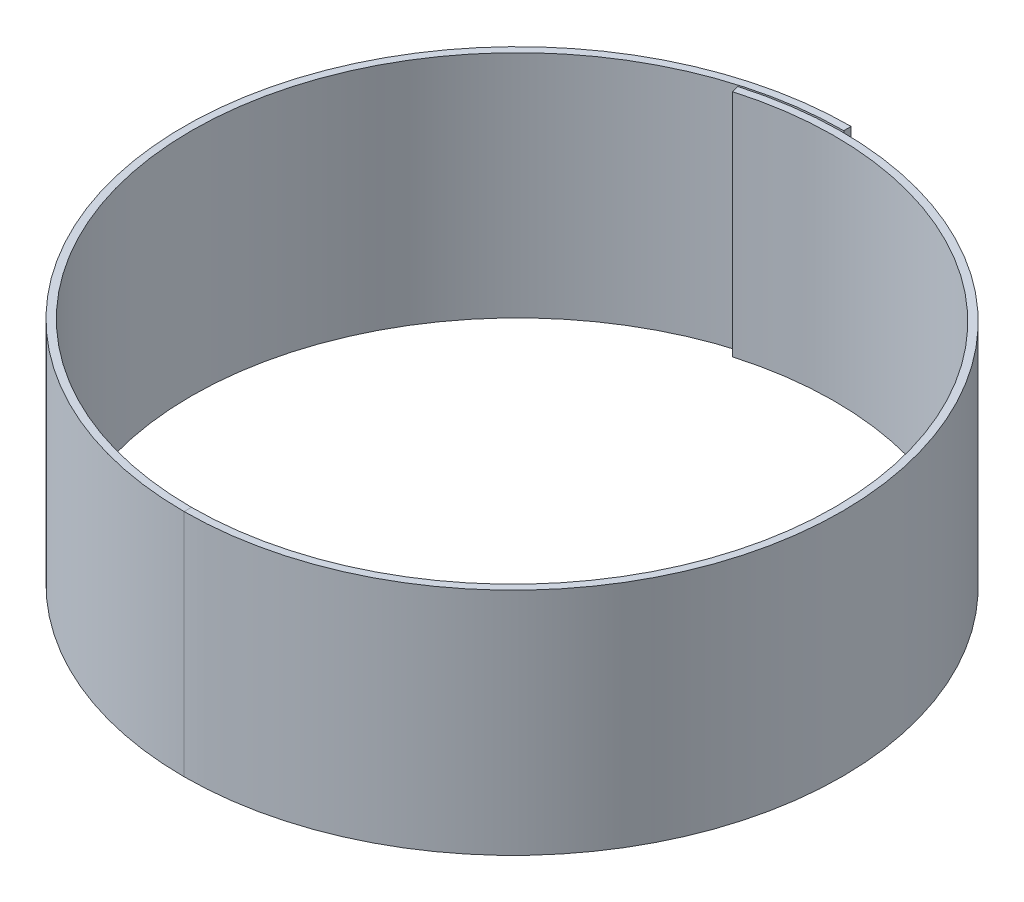
ISO-10303-21;
HEADER;
FILE_DESCRIPTION(('STEP AP214'),'2;1');
FILE_NAME('part.step','',(''),(''),'','','');
FILE_SCHEMA(('AUTOMOTIVE_DESIGN { 1 0 10303 214 1 1 1 1 }'));
ENDSEC;
DATA;
#1=APPLICATION_CONTEXT('core data for automotive mechanical design processes');
#2=APPLICATION_PROTOCOL_DEFINITION('international standard','automotive_design',2000,#1);
#3=PRODUCT_CONTEXT('',#1,'mechanical');
#4=PRODUCT('Part','Part','',(#3));
#5=PRODUCT_RELATED_PRODUCT_CATEGORY('part','',(#4));
#6=PRODUCT_DEFINITION_FORMATION('','',#4);
#7=PRODUCT_DEFINITION_CONTEXT('part definition',#1,'design');
#8=PRODUCT_DEFINITION('design','',#6,#7);
#9=PRODUCT_DEFINITION_SHAPE('','',#8);
#10=(LENGTH_UNIT() NAMED_UNIT(*) SI_UNIT(.MILLI.,.METRE.));
#11=(NAMED_UNIT(*) PLANE_ANGLE_UNIT() SI_UNIT($,.RADIAN.));
#12=(NAMED_UNIT(*) SI_UNIT($,.STERADIAN.) SOLID_ANGLE_UNIT());
#13=UNCERTAINTY_MEASURE_WITH_UNIT(LENGTH_MEASURE(1.E-05),#10,'distance_accuracy_value','');
#14=(GEOMETRIC_REPRESENTATION_CONTEXT(3) GLOBAL_UNCERTAINTY_ASSIGNED_CONTEXT((#13)) GLOBAL_UNIT_ASSIGNED_CONTEXT((#10,
#11,#12)) REPRESENTATION_CONTEXT('',''));
#15=CARTESIAN_POINT('',(0.,0.,0.));
#16=DIRECTION('',(0.,0.,1.));
#17=DIRECTION('',(1.,0.,0.));
#18=AXIS2_PLACEMENT_3D('',#15,#16,#17);
#19=CARTESIAN_POINT('',(0.,25.,36.3000000000001));
#20=DIRECTION('',(0.,1.,0.));
#21=DIRECTION('',(0.,0.,1.));
#22=AXIS2_PLACEMENT_3D('',#19,#20,#21);
#23=PLANE('',#22);
#24=DIRECTION('',(0.,0.,-1.));
#25=VECTOR('',#24,1.);
#26=CARTESIAN_POINT('',(0.,25.,36.3000000000001));
#27=LINE('',#26,#25);
#28=CARTESIAN_POINT('',(0.,25.,36.3000000000001));
#29=VERTEX_POINT('',#28);
#30=CARTESIAN_POINT('',(0.,25.,35.5000000000001));
#31=VERTEX_POINT('',#30);
#32=EDGE_CURVE('E11',#29,#31,#27,.T.);
#33=ORIENTED_EDGE('',*,*,#32,.F.);
#34=CARTESIAN_POINT('',(0.,25.,0.5));
#35=DIRECTION('',(0.,1.,0.));
#36=DIRECTION('',(1.,0.,0.));
#37=AXIS2_PLACEMENT_3D('',#34,#35,#36);
#38=CIRCLE('',#37,35.8000000000001);
#39=CARTESIAN_POINT('',(-9.93590682261841,25.,-33.8935714285715));
#40=VERTEX_POINT('',#39);
#41=EDGE_CURVE('E90',#29,#40,#38,.T.);
#42=ORIENTED_EDGE('',*,*,#41,.T.);
#43=DIRECTION('',(-0.277539296721183,0.,-0.960714285714286));
#44=VECTOR('',#43,1.);
#45=CARTESIAN_POINT('',(-9.71387538524147,25.,-33.1250000000001));
#46=LINE('',#45,#44);
#47=CARTESIAN_POINT('',(-9.71387538524147,25.,-33.1250000000001));
#48=VERTEX_POINT('',#47);
#49=EDGE_CURVE('E151',#48,#40,#46,.T.);
#50=ORIENTED_EDGE('',*,*,#49,.F.);
#51=CARTESIAN_POINT('',(0.,25.,0.5));
#52=DIRECTION('',(0.,1.,0.));
#53=DIRECTION('',(0.,0.,1.));
#54=AXIS2_PLACEMENT_3D('',#51,#52,#53);
#55=CIRCLE('',#54,35.0000000000001);
#56=EDGE_CURVE('E117',#31,#48,#55,.T.);
#57=ORIENTED_EDGE('',*,*,#56,.F.);
#58=EDGE_LOOP('',(#33,#42,#50,#57));
#59=FACE_BOUND('',#58,.T.);
#60=ADVANCED_FACE('F43',(#59),#23,.T.);
#61=CARTESIAN_POINT('',(0.,0.,35.5000000000001));
#62=DIRECTION('',(0.,-1.,0.));
#63=DIRECTION('',(0.,0.,-1.));
#64=AXIS2_PLACEMENT_3D('',#61,#62,#63);
#65=PLANE('',#64);
#66=DIRECTION('',(0.,0.,1.));
#67=VECTOR('',#66,1.);
#68=CARTESIAN_POINT('',(0.,0.,35.5000000000001));
#69=LINE('',#68,#67);
#70=CARTESIAN_POINT('',(0.,0.,35.5000000000001));
#71=VERTEX_POINT('',#70);
#72=CARTESIAN_POINT('',(0.,0.,36.3000000000001));
#73=VERTEX_POINT('',#72);
#74=EDGE_CURVE('E51',#71,#73,#69,.T.);
#75=ORIENTED_EDGE('',*,*,#74,.F.);
#76=CARTESIAN_POINT('',(0.,0.,0.5));
#77=DIRECTION('',(0.,1.,0.));
#78=DIRECTION('',(0.,0.,1.));
#79=AXIS2_PLACEMENT_3D('',#76,#77,#78);
#80=CIRCLE('',#79,35.0000000000001);
#81=CARTESIAN_POINT('',(-9.71387538524147,0.,-33.1250000000001));
#82=VERTEX_POINT('',#81);
#83=EDGE_CURVE('E132',#71,#82,#80,.T.);
#84=ORIENTED_EDGE('',*,*,#83,.T.);
#85=DIRECTION('',(-0.277539296721183,0.,-0.960714285714286));
#86=VECTOR('',#85,1.);
#87=CARTESIAN_POINT('',(-9.71387538524147,0.,-33.1250000000001));
#88=LINE('',#87,#86);
#89=CARTESIAN_POINT('',(-9.93590682261841,0.,-33.8935714285715));
#90=VERTEX_POINT('',#89);
#91=EDGE_CURVE('E129',#82,#90,#88,.T.);
#92=ORIENTED_EDGE('',*,*,#91,.T.);
#93=CARTESIAN_POINT('',(0.,0.,0.5));
#94=DIRECTION('',(0.,1.,0.));
#95=DIRECTION('',(1.,0.,0.));
#96=AXIS2_PLACEMENT_3D('',#93,#94,#95);
#97=CIRCLE('',#96,35.8000000000001);
#98=EDGE_CURVE('E126',#73,#90,#97,.T.);
#99=ORIENTED_EDGE('',*,*,#98,.F.);
#100=EDGE_LOOP('',(#75,#84,#92,#99));
#101=FACE_BOUND('',#100,.T.);
#102=ADVANCED_FACE('F157',(#101),#65,.T.);
#103=CARTESIAN_POINT('',(0.,25.,0.5));
#104=DIRECTION('',(0.,-1.,0.));
#105=DIRECTION('',(0.,0.,-1.));
#106=AXIS2_PLACEMENT_3D('',#103,#104,#105);
#107=CYLINDRICAL_SURFACE('',#106,35.8000000000001);
#108=ORIENTED_EDGE('',*,*,#98,.T.);
#109=DIRECTION('',(0.,-1.,0.));
#110=VECTOR('',#109,1.);
#111=CARTESIAN_POINT('',(-9.93590682261841,25.,-33.8935714285715));
#112=LINE('',#111,#110);
#113=EDGE_CURVE('E146',#40,#90,#112,.T.);
#114=ORIENTED_EDGE('',*,*,#113,.F.);
#115=ORIENTED_EDGE('',*,*,#41,.F.);
#116=DIRECTION('',(0.,-1.,0.));
#117=VECTOR('',#116,1.);
#118=CARTESIAN_POINT('',(0.,25.,36.3000000000001));
#119=LINE('',#118,#117);
#120=EDGE_CURVE('E122',#29,#73,#119,.T.);
#121=ORIENTED_EDGE('',*,*,#120,.T.);
#122=EDGE_LOOP('',(#108,#114,#115,#121));
#123=FACE_BOUND('',#122,.T.);
#124=ADVANCED_FACE('F154',(#123),#107,.T.);
#125=CARTESIAN_POINT('',(-9.71387538524147,25.,-33.1250000000001));
#126=DIRECTION('',(-0.960714285714286,0.,0.277539296721183));
#127=DIRECTION('',(0.277539296721183,0.,0.960714285714286));
#128=AXIS2_PLACEMENT_3D('',#125,#126,#127);
#129=PLANE('',#128);
#130=ORIENTED_EDGE('',*,*,#91,.F.);
#131=DIRECTION('',(0.,-1.,0.));
#132=VECTOR('',#131,1.);
#133=CARTESIAN_POINT('',(-9.71387538524147,25.,-33.1250000000001));
#134=LINE('',#133,#132);
#135=EDGE_CURVE('E144',#48,#82,#134,.T.);
#136=ORIENTED_EDGE('',*,*,#135,.F.);
#137=ORIENTED_EDGE('',*,*,#49,.T.);
#138=ORIENTED_EDGE('',*,*,#113,.T.);
#139=EDGE_LOOP('',(#130,#136,#137,#138));
#140=FACE_BOUND('',#139,.T.);
#141=ADVANCED_FACE('F150',(#140),#129,.T.);
#142=CARTESIAN_POINT('',(0.,25.,0.5));
#143=DIRECTION('',(0.,-1.,0.));
#144=DIRECTION('',(0.,0.,-1.));
#145=AXIS2_PLACEMENT_3D('',#142,#143,#144);
#146=CYLINDRICAL_SURFACE('',#145,35.0000000000001);
#147=ORIENTED_EDGE('',*,*,#83,.F.);
#148=DIRECTION('',(0.,-1.,0.));
#149=VECTOR('',#148,1.);
#150=CARTESIAN_POINT('',(0.,25.,35.5000000000001));
#151=LINE('',#150,#149);
#152=EDGE_CURVE('E110',#31,#71,#151,.T.);
#153=ORIENTED_EDGE('',*,*,#152,.F.);
#154=ORIENTED_EDGE('',*,*,#56,.T.);
#155=ORIENTED_EDGE('',*,*,#135,.T.);
#156=EDGE_LOOP('',(#147,#153,#154,#155));
#157=FACE_BOUND('',#156,.T.);
#158=ADVANCED_FACE('F160',(#157),#146,.F.);
#159=CARTESIAN_POINT('',(0.,25.,0.));
#160=DIRECTION('',(0.,-1.,0.));
#161=DIRECTION('',(0.,0.,-1.));
#162=AXIS2_PLACEMENT_3D('',#159,#160,#161);
#163=CYLINDRICAL_SURFACE('',#162,35.5000000000001);
#164=CARTESIAN_POINT('',(0.,0.,0.));
#165=DIRECTION('',(0.,1.,0.));
#166=DIRECTION('',(0.,0.,1.));
#167=AXIS2_PLACEMENT_3D('',#164,#165,#166);
#168=CIRCLE('',#167,35.5000000000001);
#169=CARTESIAN_POINT('',(0.,0.,-35.5000000000001));
#170=VERTEX_POINT('',#169);
#171=EDGE_CURVE('E105',#170,#71,#168,.T.);
#172=ORIENTED_EDGE('',*,*,#171,.F.);
#173=DIRECTION('',(0.,-1.,0.));
#174=VECTOR('',#173,1.);
#175=CARTESIAN_POINT('',(0.,25.,-35.5000000000001));
#176=LINE('',#175,#174);
#177=CARTESIAN_POINT('',(0.,25.,-35.5000000000001));
#178=VERTEX_POINT('',#177);
#179=EDGE_CURVE('E100',#178,#170,#176,.T.);
#180=ORIENTED_EDGE('',*,*,#179,.F.);
#181=CARTESIAN_POINT('',(0.,25.,0.));
#182=DIRECTION('',(0.,1.,0.));
#183=DIRECTION('',(0.,0.,1.));
#184=AXIS2_PLACEMENT_3D('',#181,#182,#183);
#185=CIRCLE('',#184,35.5000000000001);
#186=EDGE_CURVE('E104',#178,#31,#185,.T.);
#187=ORIENTED_EDGE('',*,*,#186,.T.);
#188=ORIENTED_EDGE('',*,*,#152,.T.);
#189=EDGE_LOOP('',(#172,#180,#187,#188));
#190=FACE_BOUND('',#189,.T.);
#191=ADVANCED_FACE('F102',(#190),#163,.F.);
#192=CARTESIAN_POINT('',(0.,25.,-36.3000000000001));
#193=DIRECTION('',(1.,0.,0.));
#194=DIRECTION('',(0.,0.,-1.));
#195=AXIS2_PLACEMENT_3D('',#192,#193,#194);
#196=PLANE('',#195);
#197=DIRECTION('',(0.,0.,1.));
#198=VECTOR('',#197,1.);
#199=CARTESIAN_POINT('',(0.,0.,-36.3000000000001));
#200=LINE('',#199,#198);
#201=CARTESIAN_POINT('',(0.,0.,-36.3000000000001));
#202=VERTEX_POINT('',#201);
#203=EDGE_CURVE('E136',#202,#170,#200,.T.);
#204=ORIENTED_EDGE('',*,*,#203,.F.);
#205=DIRECTION('',(0.,-1.,0.));
#206=VECTOR('',#205,1.);
#207=CARTESIAN_POINT('',(0.,25.,-36.3000000000001));
#208=LINE('',#207,#206);
#209=CARTESIAN_POINT('',(0.,25.,-36.3000000000001));
#210=VERTEX_POINT('',#209);
#211=EDGE_CURVE('E80',#210,#202,#208,.T.);
#212=ORIENTED_EDGE('',*,*,#211,.F.);
#213=DIRECTION('',(0.,0.,1.));
#214=VECTOR('',#213,1.);
#215=CARTESIAN_POINT('',(0.,25.,-36.3000000000001));
#216=LINE('',#215,#214);
#217=EDGE_CURVE('E115',#210,#178,#216,.T.);
#218=ORIENTED_EDGE('',*,*,#217,.T.);
#219=ORIENTED_EDGE('',*,*,#179,.T.);
#220=EDGE_LOOP('',(#204,#212,#218,#219));
#221=FACE_BOUND('',#220,.T.);
#222=ADVANCED_FACE('F119',(#221),#196,.T.);
#223=CARTESIAN_POINT('',(0.,25.,0.));
#224=DIRECTION('',(0.,-1.,0.));
#225=DIRECTION('',(0.,0.,-1.));
#226=AXIS2_PLACEMENT_3D('',#223,#224,#225);
#227=CYLINDRICAL_SURFACE('',#226,36.3000000000001);
#228=CARTESIAN_POINT('',(0.,0.,0.));
#229=DIRECTION('',(0.,1.,0.));
#230=DIRECTION('',(1.,0.,0.));
#231=AXIS2_PLACEMENT_3D('',#228,#229,#230);
#232=CIRCLE('',#231,36.3000000000001);
#233=EDGE_CURVE('E138',#202,#73,#232,.T.);
#234=ORIENTED_EDGE('',*,*,#233,.T.);
#235=ORIENTED_EDGE('',*,*,#120,.F.);
#236=CARTESIAN_POINT('',(0.,25.,0.));
#237=DIRECTION('',(0.,1.,0.));
#238=DIRECTION('',(1.,0.,0.));
#239=AXIS2_PLACEMENT_3D('',#236,#237,#238);
#240=CIRCLE('',#239,36.3000000000001);
#241=EDGE_CURVE('E120',#210,#29,#240,.T.);
#242=ORIENTED_EDGE('',*,*,#241,.F.);
#243=ORIENTED_EDGE('',*,*,#211,.T.);
#244=EDGE_LOOP('',(#234,#235,#242,#243));
#245=FACE_BOUND('',#244,.T.);
#246=ADVANCED_FACE('F163',(#245),#227,.T.);
#247=CARTESIAN_POINT('',(0.,25.,0.5));
#248=DIRECTION('',(0.,1.,0.));
#249=DIRECTION('',(1.,0.,0.));
#250=AXIS2_PLACEMENT_3D('',#247,#248,#249);
#251=PLANE('',#250);
#252=ORIENTED_EDGE('',*,*,#241,.T.);
#253=ORIENTED_EDGE('',*,*,#32,.T.);
#254=ORIENTED_EDGE('',*,*,#186,.F.);
#255=ORIENTED_EDGE('',*,*,#217,.F.);
#256=EDGE_LOOP('',(#252,#253,#254,#255));
#257=FACE_BOUND('',#256,.T.);
#258=ADVANCED_FACE('F114',(#257),#251,.T.);
#259=CARTESIAN_POINT('',(0.,0.,0.5));
#260=DIRECTION('',(0.,1.,0.));
#261=DIRECTION('',(1.,0.,0.));
#262=AXIS2_PLACEMENT_3D('',#259,#260,#261);
#263=PLANE('',#262);
#264=ORIENTED_EDGE('',*,*,#171,.T.);
#265=ORIENTED_EDGE('',*,*,#74,.T.);
#266=ORIENTED_EDGE('',*,*,#233,.F.);
#267=ORIENTED_EDGE('',*,*,#203,.T.);
#268=EDGE_LOOP('',(#264,#265,#266,#267));
#269=FACE_BOUND('',#268,.T.);
#270=ADVANCED_FACE('F162',(#269),#263,.F.);
#271=CLOSED_SHELL('',(#60,#102,#124,#141,#158,#191,#222,#246,#258,#270));
#272=MANIFOLD_SOLID_BREP('B2',#271);
#273=ADVANCED_BREP_SHAPE_REPRESENTATION('',(#18,#272),#14);
#274=SHAPE_DEFINITION_REPRESENTATION(#9,#273);
ENDSEC;
END-ISO-10303-21;
